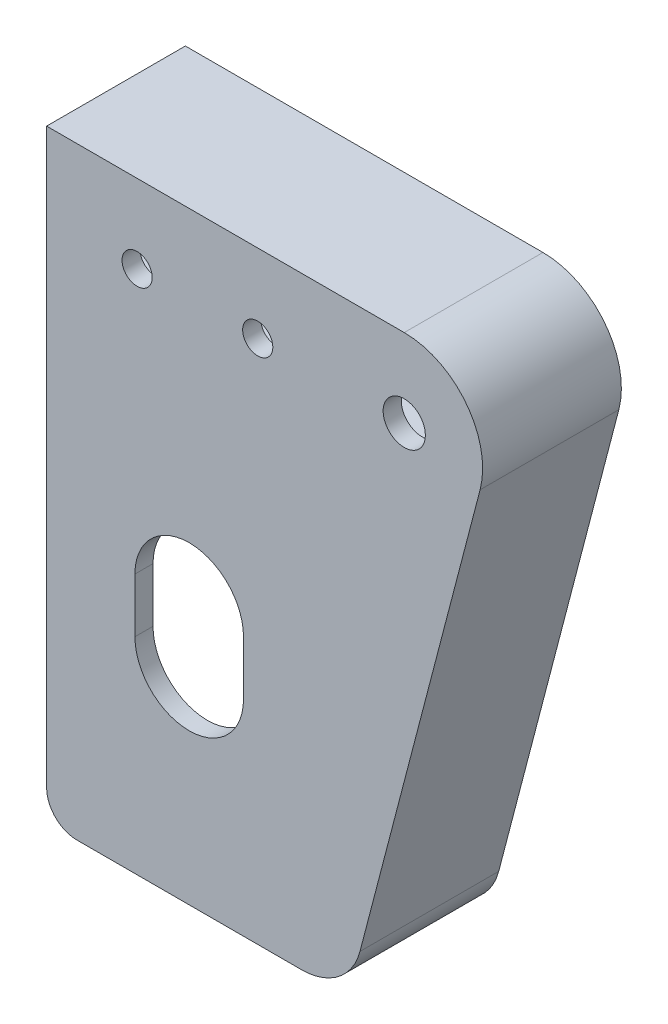
ISO-10303-21;
HEADER;
FILE_DESCRIPTION(('STEP AP214'),'2;1');
FILE_NAME('part.step','',(''),(''),'','','');
FILE_SCHEMA(('AUTOMOTIVE_DESIGN { 1 0 10303 214 1 1 1 1 }'));
ENDSEC;
DATA;
#1=APPLICATION_CONTEXT('core data for automotive mechanical design processes');
#2=APPLICATION_PROTOCOL_DEFINITION('international standard','automotive_design',2000,#1);
#3=PRODUCT_CONTEXT('',#1,'mechanical');
#4=PRODUCT('Part','Part','',(#3));
#5=PRODUCT_RELATED_PRODUCT_CATEGORY('part','',(#4));
#6=PRODUCT_DEFINITION_FORMATION('','',#4);
#7=PRODUCT_DEFINITION_CONTEXT('part definition',#1,'design');
#8=PRODUCT_DEFINITION('design','',#6,#7);
#9=PRODUCT_DEFINITION_SHAPE('','',#8);
#10=(LENGTH_UNIT() NAMED_UNIT(*) SI_UNIT(.MILLI.,.METRE.));
#11=(NAMED_UNIT(*) PLANE_ANGLE_UNIT() SI_UNIT($,.RADIAN.));
#12=(NAMED_UNIT(*) SI_UNIT($,.STERADIAN.) SOLID_ANGLE_UNIT());
#13=UNCERTAINTY_MEASURE_WITH_UNIT(LENGTH_MEASURE(1.E-05),#10,'distance_accuracy_value','');
#14=(GEOMETRIC_REPRESENTATION_CONTEXT(3) GLOBAL_UNCERTAINTY_ASSIGNED_CONTEXT((#13)) GLOBAL_UNIT_ASSIGNED_CONTEXT((#10,
#11,#12)) REPRESENTATION_CONTEXT('',''));
#15=CARTESIAN_POINT('',(0.,0.,0.));
#16=DIRECTION('',(0.,0.,1.));
#17=DIRECTION('',(1.,0.,0.));
#18=AXIS2_PLACEMENT_3D('',#15,#16,#17);
#19=CARTESIAN_POINT('',(24.289684969179,-3.,-3.));
#20=DIRECTION('',(0.,0.,1.));
#21=DIRECTION('',(1.,0.,0.));
#22=AXIS2_PLACEMENT_3D('',#19,#20,#21);
#23=CYLINDRICAL_SURFACE('',#22,13.);
#24=DIRECTION('',(0.,0.,1.));
#25=VECTOR('',#24,1.);
#26=CARTESIAN_POINT('',(36.8676410804812,-6.28557758425468,-3.));
#27=LINE('',#26,#25);
#28=CARTESIAN_POINT('',(36.8676410804812,-6.28557758425468,-23.));
#29=VERTEX_POINT('',#28);
#30=CARTESIAN_POINT('',(36.8676410804812,-6.28557758425468,0.));
#31=VERTEX_POINT('',#30);
#32=EDGE_CURVE('E280',#29,#31,#27,.T.);
#33=ORIENTED_EDGE('',*,*,#32,.F.);
#34=CARTESIAN_POINT('',(24.289684969179,-3.,-23.));
#35=DIRECTION('',(0.,0.,-1.));
#36=DIRECTION('',(-1.,0.,0.));
#37=AXIS2_PLACEMENT_3D('',#34,#35,#36);
#38=CIRCLE('',#37,13.);
#39=CARTESIAN_POINT('',(24.289684969179,10.,-23.));
#40=VERTEX_POINT('',#39);
#41=EDGE_CURVE('E311',#40,#29,#38,.T.);
#42=ORIENTED_EDGE('',*,*,#41,.F.);
#43=DIRECTION('',(0.,0.,1.));
#44=VECTOR('',#43,1.);
#45=CARTESIAN_POINT('',(24.289684969179,10.,-3.));
#46=LINE('',#45,#44);
#47=CARTESIAN_POINT('',(24.289684969179,10.,0.));
#48=VERTEX_POINT('',#47);
#49=EDGE_CURVE('E348',#40,#48,#46,.T.);
#50=ORIENTED_EDGE('',*,*,#49,.T.);
#51=CARTESIAN_POINT('',(24.289684969179,-3.,0.));
#52=DIRECTION('',(0.,0.,1.));
#53=DIRECTION('',(1.,0.,0.));
#54=AXIS2_PLACEMENT_3D('',#51,#52,#53);
#55=CIRCLE('',#54,13.);
#56=EDGE_CURVE('E341',#31,#48,#55,.T.);
#57=ORIENTED_EDGE('',*,*,#56,.F.);
#58=EDGE_LOOP('',(#33,#42,#50,#57));
#59=FACE_BOUND('',#58,.T.);
#60=ADVANCED_FACE('F39',(#59),#23,.T.);
#61=DIRECTION('',(0.,0.,1.));
#62=VECTOR('',#61,1.);
#63=CARTESIAN_POINT('',(31.8656468113469,-13.5643174018019,-23.));
#64=LINE('',#63,#62);
#65=CARTESIAN_POINT('',(31.8656468113469,-13.5643174018019,-23.));
#66=VERTEX_POINT('',#65);
#67=CARTESIAN_POINT('',(31.8656468113469,-13.5643174018019,-3.));
#68=VERTEX_POINT('',#67);
#69=EDGE_CURVE('E265',#66,#68,#64,.T.);
#70=ORIENTED_EDGE('',*,*,#69,.T.);
#71=CARTESIAN_POINT('',(24.289684969179,-3.,-3.));
#72=DIRECTION('',(0.,0.,1.));
#73=DIRECTION('',(1.,0.,0.));
#74=AXIS2_PLACEMENT_3D('',#71,#72,#73);
#75=CIRCLE('',#74,13.);
#76=CARTESIAN_POINT('',(24.289684969179,-16.,-3.));
#77=VERTEX_POINT('',#76);
#78=EDGE_CURVE('E271',#77,#68,#75,.T.);
#79=ORIENTED_EDGE('',*,*,#78,.F.);
#80=DIRECTION('',(0.,0.,1.));
#81=VECTOR('',#80,1.);
#82=CARTESIAN_POINT('',(24.289684969179,-16.,-3.));
#83=LINE('',#82,#81);
#84=CARTESIAN_POINT('',(24.289684969179,-16.,-23.));
#85=VERTEX_POINT('',#84);
#86=EDGE_CURVE('E351',#85,#77,#83,.T.);
#87=ORIENTED_EDGE('',*,*,#86,.F.);
#88=EDGE_CURVE('E310',#66,#85,#38,.T.);
#89=ORIENTED_EDGE('',*,*,#88,.F.);
#90=EDGE_LOOP('',(#70,#79,#87,#89));
#91=FACE_BOUND('',#90,.T.);
#92=ADVANCED_FACE('F426',(#91),#23,.T.);
#93=CARTESIAN_POINT('',(-35.,-16.,-3.));
#94=DIRECTION('',(0.,-1.,0.));
#95=DIRECTION('',(0.,0.,-1.));
#96=AXIS2_PLACEMENT_3D('',#93,#94,#95);
#97=PLANE('',#96);
#98=ORIENTED_EDGE('',*,*,#86,.T.);
#99=DIRECTION('',(1.,0.,0.));
#100=VECTOR('',#99,1.);
#101=CARTESIAN_POINT('',(0.,-16.,-3.));
#102=LINE('',#101,#100);
#103=CARTESIAN_POINT('',(-35.,-16.,-3.));
#104=VERTEX_POINT('',#103);
#105=EDGE_CURVE('E274',#104,#77,#102,.T.);
#106=ORIENTED_EDGE('',*,*,#105,.F.);
#107=DIRECTION('',(0.,0.,1.));
#108=VECTOR('',#107,1.);
#109=CARTESIAN_POINT('',(-35.,-16.,-3.));
#110=LINE('',#109,#108);
#111=CARTESIAN_POINT('',(-35.,-16.,-23.));
#112=VERTEX_POINT('',#111);
#113=EDGE_CURVE('E337',#112,#104,#110,.T.);
#114=ORIENTED_EDGE('',*,*,#113,.F.);
#115=DIRECTION('',(-1.,0.,0.));
#116=VECTOR('',#115,1.);
#117=CARTESIAN_POINT('',(24.289684969179,-16.,-23.));
#118=LINE('',#117,#116);
#119=EDGE_CURVE('E292',#85,#112,#118,.T.);
#120=ORIENTED_EDGE('',*,*,#119,.F.);
#121=EDGE_LOOP('',(#98,#106,#114,#120));
#122=FACE_BOUND('',#121,.T.);
#123=ADVANCED_FACE('F430',(#122),#97,.T.);
#124=CARTESIAN_POINT('',(24.289684969179,-3.,-3.));
#125=DIRECTION('',(0.,0.,1.));
#126=DIRECTION('',(1.,0.,0.));
#127=AXIS2_PLACEMENT_3D('',#124,#125,#126);
#128=PLANE('',#127);
#129=CARTESIAN_POINT('',(0.,-3.,-3.));
#130=DIRECTION('',(0.,0.,-1.));
#131=DIRECTION('',(-1.,0.,0.));
#132=AXIS2_PLACEMENT_3D('',#129,#130,#131);
#133=CIRCLE('',#132,2.5);
#134=CARTESIAN_POINT('',(-2.5,-3.,-3.));
#135=VERTEX_POINT('',#134);
#136=EDGE_CURVE('E222',#135,#135,#133,.T.);
#137=ORIENTED_EDGE('',*,*,#136,.F.);
#138=EDGE_LOOP('',(#137));
#139=FACE_BOUND('',#138,.T.);
#140=CARTESIAN_POINT('',(-20.,-3.,-3.));
#141=DIRECTION('',(0.,0.,-1.));
#142=DIRECTION('',(-1.,0.,0.));
#143=AXIS2_PLACEMENT_3D('',#140,#141,#142);
#144=CIRCLE('',#143,2.5);
#145=CARTESIAN_POINT('',(-22.5,-3.,-3.));
#146=VERTEX_POINT('',#145);
#147=EDGE_CURVE('E221',#146,#146,#144,.T.);
#148=ORIENTED_EDGE('',*,*,#147,.F.);
#149=EDGE_LOOP('',(#148));
#150=FACE_BOUND('',#149,.T.);
#151=CARTESIAN_POINT('',(24.289684969179,-3.,-3.));
#152=DIRECTION('',(0.,0.,1.));
#153=DIRECTION('',(1.,0.,0.));
#154=AXIS2_PLACEMENT_3D('',#151,#152,#153);
#155=CIRCLE('',#154,3.5);
#156=CARTESIAN_POINT('',(27.789684969179,-3.,-3.));
#157=VERTEX_POINT('',#156);
#158=EDGE_CURVE('E288',#157,#157,#155,.T.);
#159=ORIENTED_EDGE('',*,*,#158,.T.);
#160=EDGE_LOOP('',(#159));
#161=FACE_BOUND('',#160,.T.);
#162=DIRECTION('',(-1.,0.,0.));
#163=VECTOR('',#162,1.);
#164=CARTESIAN_POINT('',(24.289684969179,7.,-3.));
#165=LINE('',#164,#163);
#166=CARTESIAN_POINT('',(24.289684969179,7.,-3.));
#167=VERTEX_POINT('',#166);
#168=CARTESIAN_POINT('',(-35.,7.,-3.));
#169=VERTEX_POINT('',#168);
#170=EDGE_CURVE('E296',#167,#169,#165,.T.);
#171=ORIENTED_EDGE('',*,*,#170,.F.);
#172=CARTESIAN_POINT('',(24.289684969179,-3.,-3.));
#173=DIRECTION('',(0.,0.,1.));
#174=DIRECTION('',(-1.,0.,0.));
#175=AXIS2_PLACEMENT_3D('',#172,#173,#174);
#176=CIRCLE('',#175,10.);
#177=CARTESIAN_POINT('',(24.289684969179,-13.,-3.));
#178=VERTEX_POINT('',#177);
#179=EDGE_CURVE('E317',#178,#167,#176,.T.);
#180=ORIENTED_EDGE('',*,*,#179,.F.);
#181=DIRECTION('',(1.,0.,0.));
#182=VECTOR('',#181,1.);
#183=CARTESIAN_POINT('',(24.289684969179,-13.,-3.));
#184=LINE('',#183,#182);
#185=CARTESIAN_POINT('',(-35.,-13.,-3.));
#186=VERTEX_POINT('',#185);
#187=EDGE_CURVE('E291',#186,#178,#184,.T.);
#188=ORIENTED_EDGE('',*,*,#187,.F.);
#189=DIRECTION('',(0.,-1.,0.));
#190=VECTOR('',#189,1.);
#191=CARTESIAN_POINT('',(-35.,10.,-3.));
#192=LINE('',#191,#190);
#193=EDGE_CURVE('E334',#169,#186,#192,.T.);
#194=ORIENTED_EDGE('',*,*,#193,.F.);
#195=EDGE_LOOP('',(#171,#180,#188,#194));
#196=FACE_BOUND('',#195,.T.);
#197=ADVANCED_FACE('F422',(#139,#150,#161,#196),#128,.F.);
#198=CARTESIAN_POINT('',(-35.,10.,-3.));
#199=DIRECTION('',(-1.,0.,0.));
#200=DIRECTION('',(0.,0.,1.));
#201=AXIS2_PLACEMENT_3D('',#198,#199,#200);
#202=PLANE('',#201);
#203=DIRECTION('',(0.,-1.,0.));
#204=VECTOR('',#203,1.);
#205=CARTESIAN_POINT('',(-35.,0.,-3.));
#206=LINE('',#205,#204);
#207=CARTESIAN_POINT('',(-35.,-85.,-3.));
#208=VERTEX_POINT('',#207);
#209=EDGE_CURVE('E277',#104,#208,#206,.T.);
#210=ORIENTED_EDGE('',*,*,#209,.T.);
#211=DIRECTION('',(0.,0.,1.));
#212=VECTOR('',#211,1.);
#213=CARTESIAN_POINT('',(-35.,-85.,-3.));
#214=LINE('',#213,#212);
#215=CARTESIAN_POINT('',(-35.,-85.,0.));
#216=VERTEX_POINT('',#215);
#217=EDGE_CURVE('E362',#208,#216,#214,.T.);
#218=ORIENTED_EDGE('',*,*,#217,.T.);
#219=DIRECTION('',(0.,-1.,0.));
#220=VECTOR('',#219,1.);
#221=CARTESIAN_POINT('',(-35.,10.,0.));
#222=LINE('',#221,#220);
#223=CARTESIAN_POINT('',(-35.,10.,0.));
#224=VERTEX_POINT('',#223);
#225=EDGE_CURVE('E333',#224,#216,#222,.T.);
#226=ORIENTED_EDGE('',*,*,#225,.F.);
#227=DIRECTION('',(0.,0.,1.));
#228=VECTOR('',#227,1.);
#229=CARTESIAN_POINT('',(-35.,10.,-3.));
#230=LINE('',#229,#228);
#231=CARTESIAN_POINT('',(-35.,10.,-23.));
#232=VERTEX_POINT('',#231);
#233=EDGE_CURVE('E345',#232,#224,#230,.T.);
#234=ORIENTED_EDGE('',*,*,#233,.F.);
#235=DIRECTION('',(0.,1.,0.));
#236=VECTOR('',#235,1.);
#237=CARTESIAN_POINT('',(-35.,7.,-23.));
#238=LINE('',#237,#236);
#239=CARTESIAN_POINT('',(-35.,7.,-23.));
#240=VERTEX_POINT('',#239);
#241=EDGE_CURVE('E304',#240,#232,#238,.T.);
#242=ORIENTED_EDGE('',*,*,#241,.F.);
#243=DIRECTION('',(0.,0.,1.));
#244=VECTOR('',#243,1.);
#245=CARTESIAN_POINT('',(-35.,7.,-23.));
#246=LINE('',#245,#244);
#247=EDGE_CURVE('E314',#240,#169,#246,.T.);
#248=ORIENTED_EDGE('',*,*,#247,.T.);
#249=ORIENTED_EDGE('',*,*,#193,.T.);
#250=DIRECTION('',(0.,0.,1.));
#251=VECTOR('',#250,1.);
#252=CARTESIAN_POINT('',(-35.,-13.,-23.));
#253=LINE('',#252,#251);
#254=CARTESIAN_POINT('',(-35.,-13.,-23.));
#255=VERTEX_POINT('',#254);
#256=EDGE_CURVE('E330',#255,#186,#253,.T.);
#257=ORIENTED_EDGE('',*,*,#256,.F.);
#258=DIRECTION('',(0.,1.,0.));
#259=VECTOR('',#258,1.);
#260=CARTESIAN_POINT('',(-35.,-16.,-23.));
#261=LINE('',#260,#259);
#262=EDGE_CURVE('E295',#112,#255,#261,.T.);
#263=ORIENTED_EDGE('',*,*,#262,.F.);
#264=ORIENTED_EDGE('',*,*,#113,.T.);
#265=EDGE_LOOP('',(#210,#218,#226,#234,#242,#248,#249,#257,#263,#264));
#266=FACE_BOUND('',#265,.T.);
#267=ADVANCED_FACE('F391',(#266),#202,.T.);
#268=CARTESIAN_POINT('',(-35.,10.,-3.));
#269=DIRECTION('',(0.,1.,0.));
#270=DIRECTION('',(-1.,0.,0.));
#271=AXIS2_PLACEMENT_3D('',#268,#269,#270);
#272=PLANE('',#271);
#273=DIRECTION('',(-1.,0.,0.));
#274=VECTOR('',#273,1.);
#275=CARTESIAN_POINT('',(-35.,10.,0.));
#276=LINE('',#275,#274);
#277=EDGE_CURVE('E338',#48,#224,#276,.T.);
#278=ORIENTED_EDGE('',*,*,#277,.F.);
#279=ORIENTED_EDGE('',*,*,#49,.F.);
#280=DIRECTION('',(1.,0.,0.));
#281=VECTOR('',#280,1.);
#282=CARTESIAN_POINT('',(-35.,10.,-23.));
#283=LINE('',#282,#281);
#284=EDGE_CURVE('E307',#232,#40,#283,.T.);
#285=ORIENTED_EDGE('',*,*,#284,.F.);
#286=ORIENTED_EDGE('',*,*,#233,.T.);
#287=EDGE_LOOP('',(#278,#279,#285,#286));
#288=FACE_BOUND('',#287,.T.);
#289=ADVANCED_FACE('F381',(#288),#272,.T.);
#290=CARTESIAN_POINT('',(24.289684969179,-3.,0.));
#291=DIRECTION('',(0.,0.,1.));
#292=DIRECTION('',(1.,0.,0.));
#293=AXIS2_PLACEMENT_3D('',#290,#291,#292);
#294=PLANE('',#293);
#295=DIRECTION('',(0.,-1.,0.));
#296=VECTOR('',#295,1.);
#297=CARTESIAN_POINT('',(-20.3616856068595,-3.,0.));
#298=LINE('',#297,#296);
#299=CARTESIAN_POINT('',(-20.3616856068595,-47.,0.));
#300=VERTEX_POINT('',#299);
#301=CARTESIAN_POINT('',(-20.3616856068595,-56.,0.));
#302=VERTEX_POINT('',#301);
#303=EDGE_CURVE('E219',#300,#302,#298,.T.);
#304=ORIENTED_EDGE('',*,*,#303,.F.);
#305=CARTESIAN_POINT('',(-11.3616856068595,-47.,0.));
#306=DIRECTION('',(0.,0.,1.));
#307=DIRECTION('',(1.,0.,0.));
#308=AXIS2_PLACEMENT_3D('',#305,#306,#307);
#309=CIRCLE('',#308,9.);
#310=CARTESIAN_POINT('',(-2.36168560685954,-47.,0.));
#311=VERTEX_POINT('',#310);
#312=EDGE_CURVE('E212',#311,#300,#309,.T.);
#313=ORIENTED_EDGE('',*,*,#312,.F.);
#314=DIRECTION('',(0.,-1.,0.));
#315=VECTOR('',#314,1.);
#316=CARTESIAN_POINT('',(-2.36168560685953,-2.99999999999999,0.));
#317=LINE('',#316,#315);
#318=CARTESIAN_POINT('',(-2.36168560685954,-56.,0.));
#319=VERTEX_POINT('',#318);
#320=EDGE_CURVE('E192',#311,#319,#317,.T.);
#321=ORIENTED_EDGE('',*,*,#320,.T.);
#322=CARTESIAN_POINT('',(-11.3616856068595,-56.,0.));
#323=DIRECTION('',(0.,0.,1.));
#324=DIRECTION('',(1.,0.,0.));
#325=AXIS2_PLACEMENT_3D('',#322,#323,#324);
#326=CIRCLE('',#325,9.);
#327=EDGE_CURVE('E217',#302,#319,#326,.T.);
#328=ORIENTED_EDGE('',*,*,#327,.F.);
#329=EDGE_LOOP('',(#304,#313,#321,#328));
#330=FACE_BOUND('',#329,.T.);
#331=CARTESIAN_POINT('',(0.,-3.,0.));
#332=DIRECTION('',(0.,0.,1.));
#333=DIRECTION('',(1.,0.,0.));
#334=AXIS2_PLACEMENT_3D('',#331,#332,#333);
#335=CIRCLE('',#334,2.5);
#336=CARTESIAN_POINT('',(2.5,-3.,0.));
#337=VERTEX_POINT('',#336);
#338=EDGE_CURVE('E43',#337,#337,#335,.T.);
#339=ORIENTED_EDGE('',*,*,#338,.F.);
#340=EDGE_LOOP('',(#339));
#341=FACE_BOUND('',#340,.T.);
#342=CARTESIAN_POINT('',(-20.,-3.,0.));
#343=DIRECTION('',(0.,0.,1.));
#344=DIRECTION('',(1.,0.,0.));
#345=AXIS2_PLACEMENT_3D('',#342,#343,#344);
#346=CIRCLE('',#345,2.5);
#347=CARTESIAN_POINT('',(-17.5,-3.,0.));
#348=VERTEX_POINT('',#347);
#349=EDGE_CURVE('E225',#348,#348,#346,.T.);
#350=ORIENTED_EDGE('',*,*,#349,.F.);
#351=EDGE_LOOP('',(#350));
#352=FACE_BOUND('',#351,.T.);
#353=CARTESIAN_POINT('',(24.289684969179,-3.,0.));
#354=DIRECTION('',(0.,0.,1.));
#355=DIRECTION('',(1.,0.,0.));
#356=AXIS2_PLACEMENT_3D('',#353,#354,#355);
#357=CIRCLE('',#356,3.5);
#358=CARTESIAN_POINT('',(27.789684969179,-3.,0.));
#359=VERTEX_POINT('',#358);
#360=EDGE_CURVE('E285',#359,#359,#357,.T.);
#361=ORIENTED_EDGE('',*,*,#360,.F.);
#362=EDGE_LOOP('',(#361));
#363=FACE_BOUND('',#362,.T.);
#364=ORIENTED_EDGE('',*,*,#225,.T.);
#365=CARTESIAN_POINT('',(-30.,-85.,0.));
#366=DIRECTION('',(0.,0.,1.));
#367=DIRECTION('',(1.,0.,0.));
#368=AXIS2_PLACEMENT_3D('',#365,#366,#367);
#369=CIRCLE('',#368,5.);
#370=CARTESIAN_POINT('',(-30.,-90.,0.));
#371=VERTEX_POINT('',#370);
#372=EDGE_CURVE('E365',#216,#371,#369,.T.);
#373=ORIENTED_EDGE('',*,*,#372,.T.);
#374=DIRECTION('',(1.,0.,0.));
#375=VECTOR('',#374,1.);
#376=CARTESIAN_POINT('',(0.,-90.,0.));
#377=LINE('',#376,#375);
#378=CARTESIAN_POINT('',(7.27662878628093,-90.,0.));
#379=VERTEX_POINT('',#378);
#380=EDGE_CURVE('E270',#371,#379,#377,.T.);
#381=ORIENTED_EDGE('',*,*,#380,.T.);
#382=CARTESIAN_POINT('',(7.27662878628093,-80.,0.));
#383=DIRECTION('',(0.,0.,1.));
#384=DIRECTION('',(1.,0.,0.));
#385=AXIS2_PLACEMENT_3D('',#382,#383,#384);
#386=CIRCLE('',#385,10.);
#387=CARTESIAN_POINT('',(16.9519796411287,-82.5273673725036,0.));
#388=VERTEX_POINT('',#387);
#389=EDGE_CURVE('E358',#379,#388,#386,.T.);
#390=ORIENTED_EDGE('',*,*,#389,.T.);
#391=DIRECTION('',(0.25273673725036,0.967535085484781,0.));
#392=VECTOR('',#391,1.);
#393=CARTESIAN_POINT('',(36.0497115859211,-9.41680216224623,0.));
#394=LINE('',#393,#392);
#395=EDGE_CURVE('E275',#388,#31,#394,.T.);
#396=ORIENTED_EDGE('',*,*,#395,.T.);
#397=ORIENTED_EDGE('',*,*,#56,.T.);
#398=ORIENTED_EDGE('',*,*,#277,.T.);
#399=EDGE_LOOP('',(#364,#373,#381,#390,#396,#397,#398));
#400=FACE_BOUND('',#399,.T.);
#401=ADVANCED_FACE('F377',(#330,#341,#352,#363,#400),#294,.T.);
#402=CARTESIAN_POINT('',(24.289684969179,-13.,-23.));
#403=DIRECTION('',(0.,-1.,0.));
#404=DIRECTION('',(0.,0.,-1.));
#405=AXIS2_PLACEMENT_3D('',#402,#403,#404);
#406=PLANE('',#405);
#407=ORIENTED_EDGE('',*,*,#187,.T.);
#408=DIRECTION('',(0.,0.,1.));
#409=VECTOR('',#408,1.);
#410=CARTESIAN_POINT('',(24.289684969179,-13.,-23.));
#411=LINE('',#410,#409);
#412=CARTESIAN_POINT('',(24.289684969179,-13.,-23.));
#413=VERTEX_POINT('',#412);
#414=EDGE_CURVE('E327',#413,#178,#411,.T.);
#415=ORIENTED_EDGE('',*,*,#414,.F.);
#416=DIRECTION('',(1.,0.,0.));
#417=VECTOR('',#416,1.);
#418=CARTESIAN_POINT('',(24.289684969179,-13.,-23.));
#419=LINE('',#418,#417);
#420=EDGE_CURVE('E298',#255,#413,#419,.T.);
#421=ORIENTED_EDGE('',*,*,#420,.F.);
#422=ORIENTED_EDGE('',*,*,#256,.T.);
#423=EDGE_LOOP('',(#407,#415,#421,#422));
#424=FACE_BOUND('',#423,.T.);
#425=ADVANCED_FACE('F380',(#424),#406,.F.);
#426=CARTESIAN_POINT('',(24.289684969179,-3.,-23.));
#427=DIRECTION('',(0.,0.,1.));
#428=DIRECTION('',(1.,0.,0.));
#429=AXIS2_PLACEMENT_3D('',#426,#427,#428);
#430=CYLINDRICAL_SURFACE('',#429,10.);
#431=ORIENTED_EDGE('',*,*,#179,.T.);
#432=DIRECTION('',(0.,0.,1.));
#433=VECTOR('',#432,1.);
#434=CARTESIAN_POINT('',(24.289684969179,7.,-23.));
#435=LINE('',#434,#433);
#436=CARTESIAN_POINT('',(24.289684969179,7.,-23.));
#437=VERTEX_POINT('',#436);
#438=EDGE_CURVE('E324',#437,#167,#435,.T.);
#439=ORIENTED_EDGE('',*,*,#438,.F.);
#440=CARTESIAN_POINT('',(24.289684969179,-3.,-23.));
#441=DIRECTION('',(0.,0.,1.));
#442=DIRECTION('',(-1.,0.,0.));
#443=AXIS2_PLACEMENT_3D('',#440,#441,#442);
#444=CIRCLE('',#443,10.);
#445=EDGE_CURVE('E300',#413,#437,#444,.T.);
#446=ORIENTED_EDGE('',*,*,#445,.F.);
#447=ORIENTED_EDGE('',*,*,#414,.T.);
#448=EDGE_LOOP('',(#431,#439,#446,#447));
#449=FACE_BOUND('',#448,.T.);
#450=ADVANCED_FACE('F460',(#449),#430,.F.);
#451=CARTESIAN_POINT('',(24.289684969179,7.,-23.));
#452=DIRECTION('',(0.,1.,0.));
#453=DIRECTION('',(0.,0.,1.));
#454=AXIS2_PLACEMENT_3D('',#451,#452,#453);
#455=PLANE('',#454);
#456=ORIENTED_EDGE('',*,*,#170,.T.);
#457=ORIENTED_EDGE('',*,*,#247,.F.);
#458=DIRECTION('',(-1.,0.,0.));
#459=VECTOR('',#458,1.);
#460=CARTESIAN_POINT('',(24.289684969179,7.,-23.));
#461=LINE('',#460,#459);
#462=EDGE_CURVE('E302',#437,#240,#461,.T.);
#463=ORIENTED_EDGE('',*,*,#462,.F.);
#464=ORIENTED_EDGE('',*,*,#438,.T.);
#465=EDGE_LOOP('',(#456,#457,#463,#464));
#466=FACE_BOUND('',#465,.T.);
#467=ADVANCED_FACE('F457',(#466),#455,.F.);
#468=CARTESIAN_POINT('',(24.289684969179,-3.,-23.));
#469=DIRECTION('',(0.,0.,-1.));
#470=DIRECTION('',(-1.,0.,0.));
#471=AXIS2_PLACEMENT_3D('',#468,#469,#470);
#472=PLANE('',#471);
#473=ORIENTED_EDGE('',*,*,#119,.T.);
#474=ORIENTED_EDGE('',*,*,#262,.T.);
#475=ORIENTED_EDGE('',*,*,#420,.T.);
#476=ORIENTED_EDGE('',*,*,#445,.T.);
#477=ORIENTED_EDGE('',*,*,#462,.T.);
#478=ORIENTED_EDGE('',*,*,#241,.T.);
#479=ORIENTED_EDGE('',*,*,#284,.T.);
#480=ORIENTED_EDGE('',*,*,#41,.T.);
#481=DIRECTION('',(-0.25273673725036,-0.967535085484781,0.));
#482=VECTOR('',#481,1.);
#483=CARTESIAN_POINT('',(36.0497115859211,-9.41680216224623,-23.));
#484=LINE('',#483,#482);
#485=CARTESIAN_POINT('',(16.9519796411287,-82.5273673725036,-23.));
#486=VERTEX_POINT('',#485);
#487=EDGE_CURVE('E235',#29,#486,#484,.T.);
#488=ORIENTED_EDGE('',*,*,#487,.T.);
#489=CARTESIAN_POINT('',(7.27662878628093,-80.,-23.));
#490=DIRECTION('',(0.,0.,-1.));
#491=DIRECTION('',(-1.,0.,0.));
#492=AXIS2_PLACEMENT_3D('',#489,#490,#491);
#493=CIRCLE('',#492,10.);
#494=CARTESIAN_POINT('',(7.27662878628093,-90.,-23.));
#495=VERTEX_POINT('',#494);
#496=EDGE_CURVE('E238',#486,#495,#493,.T.);
#497=ORIENTED_EDGE('',*,*,#496,.T.);
#498=DIRECTION('',(-1.,0.,0.));
#499=VECTOR('',#498,1.);
#500=CARTESIAN_POINT('',(0.,-90.,-23.));
#501=LINE('',#500,#499);
#502=CARTESIAN_POINT('',(-30.,-90.,-23.));
#503=VERTEX_POINT('',#502);
#504=EDGE_CURVE('E241',#495,#503,#501,.T.);
#505=ORIENTED_EDGE('',*,*,#504,.T.);
#506=DIRECTION('',(0.,-1.,0.));
#507=VECTOR('',#506,1.);
#508=CARTESIAN_POINT('',(-30.0000000000001,0.,-23.));
#509=LINE('',#508,#507);
#510=CARTESIAN_POINT('',(-30.,-87.,-23.));
#511=VERTEX_POINT('',#510);
#512=EDGE_CURVE('E243',#511,#503,#509,.T.);
#513=ORIENTED_EDGE('',*,*,#512,.F.);
#514=DIRECTION('',(-1.,0.,0.));
#515=VECTOR('',#514,1.);
#516=CARTESIAN_POINT('',(0.,-87.,-23.));
#517=LINE('',#516,#515);
#518=CARTESIAN_POINT('',(7.27662878628093,-87.,-23.));
#519=VERTEX_POINT('',#518);
#520=EDGE_CURVE('E246',#519,#511,#517,.T.);
#521=ORIENTED_EDGE('',*,*,#520,.F.);
#522=CARTESIAN_POINT('',(7.27662878628093,-80.,-23.));
#523=DIRECTION('',(0.,0.,-1.));
#524=DIRECTION('',(-1.,0.,0.));
#525=AXIS2_PLACEMENT_3D('',#522,#523,#524);
#526=CIRCLE('',#525,6.99999999999999);
#527=CARTESIAN_POINT('',(14.0493743846744,-81.7691571607525,-23.));
#528=VERTEX_POINT('',#527);
#529=EDGE_CURVE('E228',#528,#519,#526,.T.);
#530=ORIENTED_EDGE('',*,*,#529,.F.);
#531=DIRECTION('',(-0.25273673725036,-0.967535085484781,0.));
#532=VECTOR('',#531,1.);
#533=CARTESIAN_POINT('',(33.1471063294667,-8.65859195049515,-23.));
#534=LINE('',#533,#532);
#535=EDGE_CURVE('E231',#66,#528,#534,.T.);
#536=ORIENTED_EDGE('',*,*,#535,.F.);
#537=ORIENTED_EDGE('',*,*,#88,.T.);
#538=EDGE_LOOP('',(#473,#474,#475,#476,#477,#478,#479,#480,#488,#497,#505,#513,#521,#530,#536,#537));
#539=FACE_BOUND('',#538,.T.);
#540=ADVANCED_FACE('F411',(#539),#472,.T.);
#541=CARTESIAN_POINT('',(24.289684969179,-3.,-20.));
#542=DIRECTION('',(0.,0.,1.));
#543=DIRECTION('',(1.,0.,0.));
#544=AXIS2_PLACEMENT_3D('',#541,#542,#543);
#545=CYLINDRICAL_SURFACE('',#544,3.5);
#546=ORIENTED_EDGE('',*,*,#360,.T.);
#547=EDGE_LOOP('',(#546));
#548=FACE_BOUND('',#547,.T.);
#549=ORIENTED_EDGE('',*,*,#158,.F.);
#550=EDGE_LOOP('',(#549));
#551=FACE_BOUND('',#550,.T.);
#552=ADVANCED_FACE('F451',(#548,#551),#545,.F.);
#553=CARTESIAN_POINT('',(0.,-90.,-3.));
#554=DIRECTION('',(0.,-1.,0.));
#555=DIRECTION('',(0.,0.,-1.));
#556=AXIS2_PLACEMENT_3D('',#553,#554,#555);
#557=PLANE('',#556);
#558=ORIENTED_EDGE('',*,*,#380,.F.);
#559=DIRECTION('',(0.,0.,1.));
#560=VECTOR('',#559,1.);
#561=CARTESIAN_POINT('',(-30.,-90.,-3.));
#562=LINE('',#561,#560);
#563=CARTESIAN_POINT('',(-30.,-90.,-3.));
#564=VERTEX_POINT('',#563);
#565=EDGE_CURVE('E48',#371,#564,#562,.F.);
#566=ORIENTED_EDGE('',*,*,#565,.T.);
#567=DIRECTION('',(0.,0.,1.));
#568=VECTOR('',#567,1.);
#569=CARTESIAN_POINT('',(-30.,-90.,-23.));
#570=LINE('',#569,#568);
#571=EDGE_CURVE('E262',#503,#564,#570,.T.);
#572=ORIENTED_EDGE('',*,*,#571,.F.);
#573=ORIENTED_EDGE('',*,*,#504,.F.);
#574=DIRECTION('',(0.,0.,1.));
#575=VECTOR('',#574,1.);
#576=CARTESIAN_POINT('',(7.27662878628093,-90.,-3.));
#577=LINE('',#576,#575);
#578=EDGE_CURVE('E347',#495,#379,#577,.T.);
#579=ORIENTED_EDGE('',*,*,#578,.T.);
#580=EDGE_LOOP('',(#558,#566,#572,#573,#579));
#581=FACE_BOUND('',#580,.T.);
#582=ADVANCED_FACE('F399',(#581),#557,.T.);
#583=CARTESIAN_POINT('',(36.0497115859211,-9.41680216224623,-3.));
#584=DIRECTION('',(0.967535085484781,-0.25273673725036,0.));
#585=DIRECTION('',(0.25273673725036,0.967535085484781,0.));
#586=AXIS2_PLACEMENT_3D('',#583,#584,#585);
#587=PLANE('',#586);
#588=ORIENTED_EDGE('',*,*,#395,.F.);
#589=DIRECTION('',(0.,0.,1.));
#590=VECTOR('',#589,1.);
#591=CARTESIAN_POINT('',(16.9519796411287,-82.5273673725036,-3.));
#592=LINE('',#591,#590);
#593=EDGE_CURVE('E360',#388,#486,#592,.F.);
#594=ORIENTED_EDGE('',*,*,#593,.T.);
#595=ORIENTED_EDGE('',*,*,#487,.F.);
#596=ORIENTED_EDGE('',*,*,#32,.T.);
#597=EDGE_LOOP('',(#588,#594,#595,#596));
#598=FACE_BOUND('',#597,.T.);
#599=ADVANCED_FACE('F409',(#598),#587,.T.);
#600=CARTESIAN_POINT('',(0.,0.,-3.));
#601=DIRECTION('',(0.,0.,1.));
#602=DIRECTION('',(1.,0.,0.));
#603=AXIS2_PLACEMENT_3D('',#600,#601,#602);
#604=PLANE('',#603);
#605=CARTESIAN_POINT('',(-11.3616856068595,-47.,-3.));
#606=DIRECTION('',(0.,0.,-1.));
#607=DIRECTION('',(-1.,0.,0.));
#608=AXIS2_PLACEMENT_3D('',#605,#606,#607);
#609=CIRCLE('',#608,9.);
#610=CARTESIAN_POINT('',(-20.3616856068595,-47.,-3.));
#611=VERTEX_POINT('',#610);
#612=CARTESIAN_POINT('',(-2.36168560685954,-47.,-3.));
#613=VERTEX_POINT('',#612);
#614=EDGE_CURVE('E198',#611,#613,#609,.T.);
#615=ORIENTED_EDGE('',*,*,#614,.F.);
#616=DIRECTION('',(0.,1.,0.));
#617=VECTOR('',#616,1.);
#618=CARTESIAN_POINT('',(-20.3616856068595,0.,-3.));
#619=LINE('',#618,#617);
#620=CARTESIAN_POINT('',(-20.3616856068595,-56.,-3.));
#621=VERTEX_POINT('',#620);
#622=EDGE_CURVE('E64',#621,#611,#619,.T.);
#623=ORIENTED_EDGE('',*,*,#622,.F.);
#624=CARTESIAN_POINT('',(-11.3616856068595,-56.,-3.));
#625=DIRECTION('',(0.,0.,-1.));
#626=DIRECTION('',(-1.,0.,0.));
#627=AXIS2_PLACEMENT_3D('',#624,#625,#626);
#628=CIRCLE('',#627,9.);
#629=CARTESIAN_POINT('',(-2.36168560685954,-56.,-3.));
#630=VERTEX_POINT('',#629);
#631=EDGE_CURVE('E205',#630,#621,#628,.T.);
#632=ORIENTED_EDGE('',*,*,#631,.F.);
#633=DIRECTION('',(0.,1.,0.));
#634=VECTOR('',#633,1.);
#635=CARTESIAN_POINT('',(-2.36168560685953,0.,-3.));
#636=LINE('',#635,#634);
#637=EDGE_CURVE('E189',#630,#613,#636,.T.);
#638=ORIENTED_EDGE('',*,*,#637,.T.);
#639=EDGE_LOOP('',(#615,#623,#632,#638));
#640=FACE_BOUND('',#639,.T.);
#641=ORIENTED_EDGE('',*,*,#78,.T.);
#642=DIRECTION('',(-0.25273673725036,-0.967535085484781,0.));
#643=VECTOR('',#642,1.);
#644=CARTESIAN_POINT('',(33.1471063294667,-8.65859195049515,-3.));
#645=LINE('',#644,#643);
#646=CARTESIAN_POINT('',(14.0493743846744,-81.7691571607525,-3.));
#647=VERTEX_POINT('',#646);
#648=EDGE_CURVE('E252',#68,#647,#645,.T.);
#649=ORIENTED_EDGE('',*,*,#648,.T.);
#650=CARTESIAN_POINT('',(7.27662878628093,-80.,-3.));
#651=DIRECTION('',(0.,0.,-1.));
#652=DIRECTION('',(-1.,0.,0.));
#653=AXIS2_PLACEMENT_3D('',#650,#651,#652);
#654=CIRCLE('',#653,6.99999999999999);
#655=CARTESIAN_POINT('',(7.27662878628093,-87.,-3.));
#656=VERTEX_POINT('',#655);
#657=EDGE_CURVE('E250',#647,#656,#654,.T.);
#658=ORIENTED_EDGE('',*,*,#657,.T.);
#659=DIRECTION('',(-1.,0.,0.));
#660=VECTOR('',#659,1.);
#661=CARTESIAN_POINT('',(0.,-87.,-3.));
#662=LINE('',#661,#660);
#663=CARTESIAN_POINT('',(-30.,-87.,-3.));
#664=VERTEX_POINT('',#663);
#665=EDGE_CURVE('E232',#656,#664,#662,.T.);
#666=ORIENTED_EDGE('',*,*,#665,.T.);
#667=DIRECTION('',(0.,-1.,0.));
#668=VECTOR('',#667,1.);
#669=CARTESIAN_POINT('',(-30.0000000000001,0.,-3.));
#670=LINE('',#669,#668);
#671=EDGE_CURVE('E254',#664,#564,#670,.T.);
#672=ORIENTED_EDGE('',*,*,#671,.T.);
#673=CARTESIAN_POINT('',(-30.,-85.,-3.));
#674=DIRECTION('',(0.,0.,1.));
#675=DIRECTION('',(1.,0.,0.));
#676=AXIS2_PLACEMENT_3D('',#673,#674,#675);
#677=CIRCLE('',#676,5.);
#678=EDGE_CURVE('E11',#564,#208,#677,.F.);
#679=ORIENTED_EDGE('',*,*,#678,.T.);
#680=ORIENTED_EDGE('',*,*,#209,.F.);
#681=ORIENTED_EDGE('',*,*,#105,.T.);
#682=EDGE_LOOP('',(#641,#649,#658,#666,#672,#679,#680,#681));
#683=FACE_BOUND('',#682,.T.);
#684=ADVANCED_FACE('F202',(#640,#683),#604,.F.);
#685=CARTESIAN_POINT('',(7.27662878628093,-80.,-3.));
#686=DIRECTION('',(0.,0.,1.));
#687=DIRECTION('',(1.,0.,0.));
#688=AXIS2_PLACEMENT_3D('',#685,#686,#687);
#689=CYLINDRICAL_SURFACE('',#688,10.);
#690=ORIENTED_EDGE('',*,*,#578,.F.);
#691=ORIENTED_EDGE('',*,*,#496,.F.);
#692=ORIENTED_EDGE('',*,*,#593,.F.);
#693=ORIENTED_EDGE('',*,*,#389,.F.);
#694=EDGE_LOOP('',(#690,#691,#692,#693));
#695=FACE_BOUND('',#694,.T.);
#696=ADVANCED_FACE('F405',(#695),#689,.T.);
#697=CARTESIAN_POINT('',(-30.,-85.,-3.));
#698=DIRECTION('',(0.,0.,1.));
#699=DIRECTION('',(1.,0.,0.));
#700=AXIS2_PLACEMENT_3D('',#697,#698,#699);
#701=CYLINDRICAL_SURFACE('',#700,5.);
#702=ORIENTED_EDGE('',*,*,#678,.F.);
#703=ORIENTED_EDGE('',*,*,#565,.F.);
#704=ORIENTED_EDGE('',*,*,#372,.F.);
#705=ORIENTED_EDGE('',*,*,#217,.F.);
#706=EDGE_LOOP('',(#702,#703,#704,#705));
#707=FACE_BOUND('',#706,.T.);
#708=ADVANCED_FACE('F41',(#707),#701,.T.);
#709=CARTESIAN_POINT('',(7.27662878628093,-80.,-23.));
#710=DIRECTION('',(0.,0.,1.));
#711=DIRECTION('',(1.,0.,0.));
#712=AXIS2_PLACEMENT_3D('',#709,#710,#711);
#713=CYLINDRICAL_SURFACE('',#712,6.99999999999999);
#714=ORIENTED_EDGE('',*,*,#657,.F.);
#715=DIRECTION('',(0.,0.,1.));
#716=VECTOR('',#715,1.);
#717=CARTESIAN_POINT('',(14.0493743846744,-81.7691571607525,-23.));
#718=LINE('',#717,#716);
#719=EDGE_CURVE('E267',#528,#647,#718,.T.);
#720=ORIENTED_EDGE('',*,*,#719,.F.);
#721=ORIENTED_EDGE('',*,*,#529,.T.);
#722=DIRECTION('',(0.,0.,1.));
#723=VECTOR('',#722,1.);
#724=CARTESIAN_POINT('',(7.27662878628093,-87.,-23.));
#725=LINE('',#724,#723);
#726=EDGE_CURVE('E249',#519,#656,#725,.T.);
#727=ORIENTED_EDGE('',*,*,#726,.T.);
#728=EDGE_LOOP('',(#714,#720,#721,#727));
#729=FACE_BOUND('',#728,.T.);
#730=ADVANCED_FACE('F440',(#729),#713,.F.);
#731=CARTESIAN_POINT('',(33.1471063294667,-8.65859195049515,-23.));
#732=DIRECTION('',(-0.967535085484781,0.25273673725036,0.));
#733=DIRECTION('',(-0.25273673725036,-0.967535085484781,0.));
#734=AXIS2_PLACEMENT_3D('',#731,#732,#733);
#735=PLANE('',#734);
#736=ORIENTED_EDGE('',*,*,#648,.F.);
#737=ORIENTED_EDGE('',*,*,#69,.F.);
#738=ORIENTED_EDGE('',*,*,#535,.T.);
#739=ORIENTED_EDGE('',*,*,#719,.T.);
#740=EDGE_LOOP('',(#736,#737,#738,#739));
#741=FACE_BOUND('',#740,.T.);
#742=ADVANCED_FACE('F494',(#741),#735,.T.);
#743=CARTESIAN_POINT('',(-30.0000000000001,0.,-23.));
#744=DIRECTION('',(-1.,0.,0.));
#745=DIRECTION('',(0.,-1.,0.));
#746=AXIS2_PLACEMENT_3D('',#743,#744,#745);
#747=PLANE('',#746);
#748=ORIENTED_EDGE('',*,*,#671,.F.);
#749=DIRECTION('',(0.,0.,1.));
#750=VECTOR('',#749,1.);
#751=CARTESIAN_POINT('',(-30.,-87.,-23.));
#752=LINE('',#751,#750);
#753=EDGE_CURVE('E259',#511,#664,#752,.T.);
#754=ORIENTED_EDGE('',*,*,#753,.F.);
#755=ORIENTED_EDGE('',*,*,#512,.T.);
#756=ORIENTED_EDGE('',*,*,#571,.T.);
#757=EDGE_LOOP('',(#748,#754,#755,#756));
#758=FACE_BOUND('',#757,.T.);
#759=ADVANCED_FACE('F505',(#758),#747,.T.);
#760=CARTESIAN_POINT('',(0.,-87.,-23.));
#761=DIRECTION('',(0.,1.,0.));
#762=DIRECTION('',(0.,0.,1.));
#763=AXIS2_PLACEMENT_3D('',#760,#761,#762);
#764=PLANE('',#763);
#765=ORIENTED_EDGE('',*,*,#665,.F.);
#766=ORIENTED_EDGE('',*,*,#726,.F.);
#767=ORIENTED_EDGE('',*,*,#520,.T.);
#768=ORIENTED_EDGE('',*,*,#753,.T.);
#769=EDGE_LOOP('',(#765,#766,#767,#768));
#770=FACE_BOUND('',#769,.T.);
#771=ADVANCED_FACE('F503',(#770),#764,.T.);
#772=CARTESIAN_POINT('',(-20.,-3.,17.));
#773=DIRECTION('',(0.,0.,-1.));
#774=DIRECTION('',(-1.,0.,0.));
#775=AXIS2_PLACEMENT_3D('',#772,#773,#774);
#776=CYLINDRICAL_SURFACE('',#775,2.5);
#777=ORIENTED_EDGE('',*,*,#349,.T.);
#778=EDGE_LOOP('',(#777));
#779=FACE_BOUND('',#778,.T.);
#780=ORIENTED_EDGE('',*,*,#147,.T.);
#781=EDGE_LOOP('',(#780));
#782=FACE_BOUND('',#781,.T.);
#783=ADVANCED_FACE('F512',(#779,#782),#776,.F.);
#784=CARTESIAN_POINT('',(0.,-3.,17.));
#785=DIRECTION('',(0.,0.,-1.));
#786=DIRECTION('',(-1.,0.,0.));
#787=AXIS2_PLACEMENT_3D('',#784,#785,#786);
#788=CYLINDRICAL_SURFACE('',#787,2.5);
#789=ORIENTED_EDGE('',*,*,#338,.T.);
#790=EDGE_LOOP('',(#789));
#791=FACE_BOUND('',#790,.T.);
#792=ORIENTED_EDGE('',*,*,#136,.T.);
#793=EDGE_LOOP('',(#792));
#794=FACE_BOUND('',#793,.T.);
#795=ADVANCED_FACE('F374',(#791,#794),#788,.F.);
#796=CARTESIAN_POINT('',(-20.3616856068595,0.,17.));
#797=DIRECTION('',(-1.,0.,0.));
#798=DIRECTION('',(0.,0.,1.));
#799=AXIS2_PLACEMENT_3D('',#796,#797,#798);
#800=PLANE('',#799);
#801=ORIENTED_EDGE('',*,*,#303,.T.);
#802=DIRECTION('',(0.,0.,-1.));
#803=VECTOR('',#802,1.);
#804=CARTESIAN_POINT('',(-20.3616856068595,-56.,17.));
#805=LINE('',#804,#803);
#806=EDGE_CURVE('E210',#302,#621,#805,.T.);
#807=ORIENTED_EDGE('',*,*,#806,.T.);
#808=ORIENTED_EDGE('',*,*,#622,.T.);
#809=DIRECTION('',(0.,0.,-1.));
#810=VECTOR('',#809,1.);
#811=CARTESIAN_POINT('',(-20.3616856068595,-47.,17.));
#812=LINE('',#811,#810);
#813=EDGE_CURVE('E195',#300,#611,#812,.T.);
#814=ORIENTED_EDGE('',*,*,#813,.F.);
#815=EDGE_LOOP('',(#801,#807,#808,#814));
#816=FACE_BOUND('',#815,.T.);
#817=ADVANCED_FACE('F519',(#816),#800,.F.);
#818=CARTESIAN_POINT('',(-11.3616856068595,-56.,17.));
#819=DIRECTION('',(0.,0.,-1.));
#820=DIRECTION('',(-1.,0.,0.));
#821=AXIS2_PLACEMENT_3D('',#818,#819,#820);
#822=CYLINDRICAL_SURFACE('',#821,9.);
#823=ORIENTED_EDGE('',*,*,#327,.T.);
#824=DIRECTION('',(0.,0.,-1.));
#825=VECTOR('',#824,1.);
#826=CARTESIAN_POINT('',(-2.36168560685954,-56.,17.));
#827=LINE('',#826,#825);
#828=EDGE_CURVE('E194',#319,#630,#827,.T.);
#829=ORIENTED_EDGE('',*,*,#828,.T.);
#830=ORIENTED_EDGE('',*,*,#631,.T.);
#831=ORIENTED_EDGE('',*,*,#806,.F.);
#832=EDGE_LOOP('',(#823,#829,#830,#831));
#833=FACE_BOUND('',#832,.T.);
#834=ADVANCED_FACE('F522',(#833),#822,.F.);
#835=CARTESIAN_POINT('',(-2.36168560685953,0.,17.));
#836=DIRECTION('',(-1.,0.,0.));
#837=DIRECTION('',(0.,-1.,0.));
#838=AXIS2_PLACEMENT_3D('',#835,#836,#837);
#839=PLANE('',#838);
#840=DIRECTION('',(0.,0.,-1.));
#841=VECTOR('',#840,1.);
#842=CARTESIAN_POINT('',(-2.36168560685954,-47.,17.));
#843=LINE('',#842,#841);
#844=EDGE_CURVE('E56',#311,#613,#843,.T.);
#845=ORIENTED_EDGE('',*,*,#844,.T.);
#846=ORIENTED_EDGE('',*,*,#637,.F.);
#847=ORIENTED_EDGE('',*,*,#828,.F.);
#848=ORIENTED_EDGE('',*,*,#320,.F.);
#849=EDGE_LOOP('',(#845,#846,#847,#848));
#850=FACE_BOUND('',#849,.T.);
#851=ADVANCED_FACE('F186',(#850),#839,.T.);
#852=CARTESIAN_POINT('',(-11.3616856068595,-47.,17.));
#853=DIRECTION('',(0.,0.,-1.));
#854=DIRECTION('',(-1.,0.,0.));
#855=AXIS2_PLACEMENT_3D('',#852,#853,#854);
#856=CYLINDRICAL_SURFACE('',#855,9.);
#857=ORIENTED_EDGE('',*,*,#312,.T.);
#858=ORIENTED_EDGE('',*,*,#813,.T.);
#859=ORIENTED_EDGE('',*,*,#614,.T.);
#860=ORIENTED_EDGE('',*,*,#844,.F.);
#861=EDGE_LOOP('',(#857,#858,#859,#860));
#862=FACE_BOUND('',#861,.T.);
#863=ADVANCED_FACE('F199',(#862),#856,.F.);
#864=CLOSED_SHELL('',(#60,#92,#123,#197,#267,#289,#401,#425,#450,#467,#540,#552,#582,#599,#684,
#696,#708,#730,#742,#759,#771,#783,#795,#817,#834,#851,#863));
#865=MANIFOLD_SOLID_BREP('B2',#864);
#866=ADVANCED_BREP_SHAPE_REPRESENTATION('',(#18,#865),#14);
#867=SHAPE_DEFINITION_REPRESENTATION(#9,#866);
ENDSEC;
END-ISO-10303-21;
